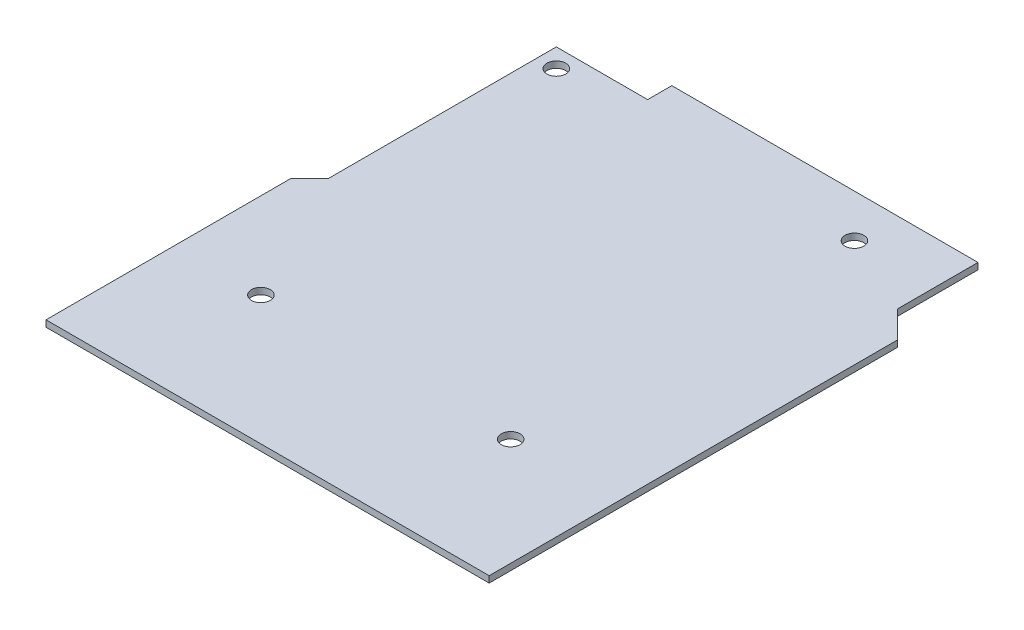
ISO-10303-21;
HEADER;
FILE_DESCRIPTION(('STEP AP214'),'2;1');
FILE_NAME('part.step','',(''),(''),'','','');
FILE_SCHEMA(('AUTOMOTIVE_DESIGN { 1 0 10303 214 1 1 1 1 }'));
ENDSEC;
DATA;
#1=APPLICATION_CONTEXT('core data for automotive mechanical design processes');
#2=APPLICATION_PROTOCOL_DEFINITION('international standard','automotive_design',2000,#1);
#3=PRODUCT_CONTEXT('',#1,'mechanical');
#4=PRODUCT('Part','Part','',(#3));
#5=PRODUCT_RELATED_PRODUCT_CATEGORY('part','',(#4));
#6=PRODUCT_DEFINITION_FORMATION('','',#4);
#7=PRODUCT_DEFINITION_CONTEXT('part definition',#1,'design');
#8=PRODUCT_DEFINITION('design','',#6,#7);
#9=PRODUCT_DEFINITION_SHAPE('','',#8);
#10=(LENGTH_UNIT() NAMED_UNIT(*) SI_UNIT(.MILLI.,.METRE.));
#11=(NAMED_UNIT(*) PLANE_ANGLE_UNIT() SI_UNIT($,.RADIAN.));
#12=(NAMED_UNIT(*) SI_UNIT($,.STERADIAN.) SOLID_ANGLE_UNIT());
#13=UNCERTAINTY_MEASURE_WITH_UNIT(LENGTH_MEASURE(1.E-05),#10,'distance_accuracy_value','');
#14=(GEOMETRIC_REPRESENTATION_CONTEXT(3) GLOBAL_UNCERTAINTY_ASSIGNED_CONTEXT((#13)) GLOBAL_UNIT_ASSIGNED_CONTEXT((#10,
#11,#12)) REPRESENTATION_CONTEXT('',''));
#15=CARTESIAN_POINT('',(0.,0.,0.));
#16=DIRECTION('',(0.,0.,1.));
#17=DIRECTION('',(1.,0.,0.));
#18=AXIS2_PLACEMENT_3D('',#15,#16,#17);
#19=CARTESIAN_POINT('',(0.,1.2,0.));
#20=DIRECTION('',(0.,-1.,0.));
#21=DIRECTION('',(0.,0.,-1.));
#22=AXIS2_PLACEMENT_3D('',#19,#20,#21);
#23=PLANE('',#22);
#24=DIRECTION('',(1.,0.,0.));
#25=VECTOR('',#24,1.);
#26=CARTESIAN_POINT('',(82.5,1.2,0.));
#27=LINE('',#26,#25);
#28=CARTESIAN_POINT('',(0.,1.2,0.));
#29=VERTEX_POINT('',#28);
#30=CARTESIAN_POINT('',(82.5,1.2,0.));
#31=VERTEX_POINT('',#30);
#32=EDGE_CURVE('E182',#29,#31,#27,.T.);
#33=ORIENTED_EDGE('',*,*,#32,.T.);
#34=DIRECTION('',(0.,0.,-1.));
#35=VECTOR('',#34,1.);
#36=CARTESIAN_POINT('',(82.5,1.2,-76.));
#37=LINE('',#36,#35);
#38=CARTESIAN_POINT('',(82.5,1.2,-76.));
#39=VERTEX_POINT('',#38);
#40=EDGE_CURVE('E106',#31,#39,#37,.T.);
#41=ORIENTED_EDGE('',*,*,#40,.T.);
#42=DIRECTION('',(-0.707106781186548,0.,-0.707106781186548));
#43=VECTOR('',#42,1.);
#44=CARTESIAN_POINT('',(77.5,1.2,-81.));
#45=LINE('',#44,#43);
#46=CARTESIAN_POINT('',(77.5,1.2,-81.));
#47=VERTEX_POINT('',#46);
#48=EDGE_CURVE('E211',#39,#47,#45,.T.);
#49=ORIENTED_EDGE('',*,*,#48,.T.);
#50=DIRECTION('',(0.,0.,-1.));
#51=VECTOR('',#50,1.);
#52=CARTESIAN_POINT('',(77.5,1.2,-96.));
#53=LINE('',#52,#51);
#54=CARTESIAN_POINT('',(77.5,1.2,-96.));
#55=VERTEX_POINT('',#54);
#56=EDGE_CURVE('E231',#47,#55,#53,.T.);
#57=ORIENTED_EDGE('',*,*,#56,.T.);
#58=DIRECTION('',(-1.,0.,0.));
#59=VECTOR('',#58,1.);
#60=CARTESIAN_POINT('',(20.5,1.2,-96.));
#61=LINE('',#60,#59);
#62=CARTESIAN_POINT('',(20.5,1.2,-96.));
#63=VERTEX_POINT('',#62);
#64=EDGE_CURVE('E227',#55,#63,#61,.T.);
#65=ORIENTED_EDGE('',*,*,#64,.T.);
#66=DIRECTION('',(0.,0.,1.));
#67=VECTOR('',#66,1.);
#68=CARTESIAN_POINT('',(20.5,1.2,-91.5));
#69=LINE('',#68,#67);
#70=CARTESIAN_POINT('',(20.5,1.2,-91.5));
#71=VERTEX_POINT('',#70);
#72=EDGE_CURVE('E230',#63,#71,#69,.T.);
#73=ORIENTED_EDGE('',*,*,#72,.T.);
#74=DIRECTION('',(-1.,0.,0.));
#75=VECTOR('',#74,1.);
#76=CARTESIAN_POINT('',(3.5,1.2,-91.5));
#77=LINE('',#76,#75);
#78=CARTESIAN_POINT('',(3.5,1.2,-91.5));
#79=VERTEX_POINT('',#78);
#80=EDGE_CURVE('E131',#71,#79,#77,.T.);
#81=ORIENTED_EDGE('',*,*,#80,.T.);
#82=DIRECTION('',(0.,0.,1.));
#83=VECTOR('',#82,1.);
#84=CARTESIAN_POINT('',(3.5,1.2,-49.));
#85=LINE('',#84,#83);
#86=CARTESIAN_POINT('',(3.5,1.2,-49.));
#87=VERTEX_POINT('',#86);
#88=EDGE_CURVE('E125',#79,#87,#85,.T.);
#89=ORIENTED_EDGE('',*,*,#88,.T.);
#90=DIRECTION('',(-0.707106781186547,0.,0.707106781186548));
#91=VECTOR('',#90,1.);
#92=CARTESIAN_POINT('',(0.,1.2,-45.5));
#93=LINE('',#92,#91);
#94=CARTESIAN_POINT('',(0.,1.2,-45.5));
#95=VERTEX_POINT('',#94);
#96=EDGE_CURVE('E129',#87,#95,#93,.T.);
#97=ORIENTED_EDGE('',*,*,#96,.T.);
#98=DIRECTION('',(0.,0.,1.));
#99=VECTOR('',#98,1.);
#100=CARTESIAN_POINT('',(0.,1.2,0.));
#101=LINE('',#100,#99);
#102=EDGE_CURVE('E57',#95,#29,#101,.T.);
#103=ORIENTED_EDGE('',*,*,#102,.T.);
#104=EDGE_LOOP('',(#33,#41,#49,#57,#65,#73,#81,#89,#97,#103));
#105=FACE_BOUND('',#104,.T.);
#106=CARTESIAN_POINT('',(6.99999999999999,1.2,-88.));
#107=DIRECTION('',(0.,1.,0.));
#108=DIRECTION('',(0.,0.,1.));
#109=AXIS2_PLACEMENT_3D('',#106,#107,#108);
#110=CIRCLE('',#109,1.75);
#111=CARTESIAN_POINT('',(6.99999999999999,1.2,-86.25));
#112=VERTEX_POINT('',#111);
#113=EDGE_CURVE('E158',#112,#112,#110,.T.);
#114=ORIENTED_EDGE('',*,*,#113,.F.);
#115=EDGE_LOOP('',(#114));
#116=FACE_BOUND('',#115,.T.);
#117=CARTESIAN_POINT('',(62.5,1.2,-88.));
#118=DIRECTION('',(0.,1.,0.));
#119=DIRECTION('',(0.,0.,1.));
#120=AXIS2_PLACEMENT_3D('',#117,#118,#119);
#121=CIRCLE('',#120,1.75);
#122=CARTESIAN_POINT('',(62.5,1.2,-86.25));
#123=VERTEX_POINT('',#122);
#124=EDGE_CURVE('E249',#123,#123,#121,.T.);
#125=ORIENTED_EDGE('',*,*,#124,.F.);
#126=EDGE_LOOP('',(#125));
#127=FACE_BOUND('',#126,.T.);
#128=CARTESIAN_POINT('',(62.5,1.2,-24.));
#129=DIRECTION('',(0.,1.,0.));
#130=DIRECTION('',(0.,0.,1.));
#131=AXIS2_PLACEMENT_3D('',#128,#129,#130);
#132=CIRCLE('',#131,1.75);
#133=CARTESIAN_POINT('',(62.5,1.2,-22.25));
#134=VERTEX_POINT('',#133);
#135=EDGE_CURVE('E257',#134,#134,#132,.T.);
#136=ORIENTED_EDGE('',*,*,#135,.F.);
#137=EDGE_LOOP('',(#136));
#138=FACE_BOUND('',#137,.T.);
#139=CARTESIAN_POINT('',(16.,1.2,-24.));
#140=DIRECTION('',(0.,1.,0.));
#141=DIRECTION('',(0.,0.,1.));
#142=AXIS2_PLACEMENT_3D('',#139,#140,#141);
#143=CIRCLE('',#142,1.75);
#144=CARTESIAN_POINT('',(16.,1.2,-22.25));
#145=VERTEX_POINT('',#144);
#146=EDGE_CURVE('E265',#145,#145,#143,.T.);
#147=ORIENTED_EDGE('',*,*,#146,.F.);
#148=EDGE_LOOP('',(#147));
#149=FACE_BOUND('',#148,.T.);
#150=ADVANCED_FACE('F39',(#105,#116,#127,#138,#149),#23,.F.);
#151=CARTESIAN_POINT('',(0.,0.,0.));
#152=DIRECTION('',(0.,-1.,0.));
#153=DIRECTION('',(0.,0.,-1.));
#154=AXIS2_PLACEMENT_3D('',#151,#152,#153);
#155=PLANE('',#154);
#156=CARTESIAN_POINT('',(62.5,0.,-24.));
#157=DIRECTION('',(0.,1.,0.));
#158=DIRECTION('',(0.,0.,1.));
#159=AXIS2_PLACEMENT_3D('',#156,#157,#158);
#160=CIRCLE('',#159,1.75);
#161=CARTESIAN_POINT('',(62.5,0.,-22.25));
#162=VERTEX_POINT('',#161);
#163=EDGE_CURVE('E261',#162,#162,#160,.T.);
#164=ORIENTED_EDGE('',*,*,#163,.T.);
#165=EDGE_LOOP('',(#164));
#166=FACE_BOUND('',#165,.T.);
#167=CARTESIAN_POINT('',(6.99999999999999,0.,-88.));
#168=DIRECTION('',(0.,1.,0.));
#169=DIRECTION('',(0.,0.,1.));
#170=AXIS2_PLACEMENT_3D('',#167,#168,#169);
#171=CIRCLE('',#170,1.75);
#172=CARTESIAN_POINT('',(6.99999999999999,0.,-86.25));
#173=VERTEX_POINT('',#172);
#174=EDGE_CURVE('E245',#173,#173,#171,.T.);
#175=ORIENTED_EDGE('',*,*,#174,.T.);
#176=EDGE_LOOP('',(#175));
#177=FACE_BOUND('',#176,.T.);
#178=DIRECTION('',(1.,0.,0.));
#179=VECTOR('',#178,1.);
#180=CARTESIAN_POINT('',(82.5,0.,0.));
#181=LINE('',#180,#179);
#182=CARTESIAN_POINT('',(0.,0.,0.));
#183=VERTEX_POINT('',#182);
#184=CARTESIAN_POINT('',(82.5,0.,0.));
#185=VERTEX_POINT('',#184);
#186=EDGE_CURVE('E153',#183,#185,#181,.T.);
#187=ORIENTED_EDGE('',*,*,#186,.F.);
#188=DIRECTION('',(0.,0.,1.));
#189=VECTOR('',#188,1.);
#190=CARTESIAN_POINT('',(0.,0.,0.));
#191=LINE('',#190,#189);
#192=CARTESIAN_POINT('',(0.,0.,-45.5));
#193=VERTEX_POINT('',#192);
#194=EDGE_CURVE('E98',#193,#183,#191,.T.);
#195=ORIENTED_EDGE('',*,*,#194,.F.);
#196=DIRECTION('',(-0.707106781186547,0.,0.707106781186548));
#197=VECTOR('',#196,1.);
#198=CARTESIAN_POINT('',(0.,0.,-45.5));
#199=LINE('',#198,#197);
#200=CARTESIAN_POINT('',(3.5,0.,-49.));
#201=VERTEX_POINT('',#200);
#202=EDGE_CURVE('E92',#201,#193,#199,.T.);
#203=ORIENTED_EDGE('',*,*,#202,.F.);
#204=DIRECTION('',(0.,0.,1.));
#205=VECTOR('',#204,1.);
#206=CARTESIAN_POINT('',(3.5,0.,-49.));
#207=LINE('',#206,#205);
#208=CARTESIAN_POINT('',(3.5,0.,-91.5));
#209=VERTEX_POINT('',#208);
#210=EDGE_CURVE('E140',#209,#201,#207,.T.);
#211=ORIENTED_EDGE('',*,*,#210,.F.);
#212=DIRECTION('',(-1.,0.,0.));
#213=VECTOR('',#212,1.);
#214=CARTESIAN_POINT('',(3.5,0.,-91.5));
#215=LINE('',#214,#213);
#216=CARTESIAN_POINT('',(20.5,0.,-91.5));
#217=VERTEX_POINT('',#216);
#218=EDGE_CURVE('E173',#217,#209,#215,.T.);
#219=ORIENTED_EDGE('',*,*,#218,.F.);
#220=DIRECTION('',(0.,0.,1.));
#221=VECTOR('',#220,1.);
#222=CARTESIAN_POINT('',(20.5,0.,-91.5));
#223=LINE('',#222,#221);
#224=CARTESIAN_POINT('',(20.5,0.,-96.));
#225=VERTEX_POINT('',#224);
#226=EDGE_CURVE('E170',#225,#217,#223,.T.);
#227=ORIENTED_EDGE('',*,*,#226,.F.);
#228=DIRECTION('',(-1.,0.,0.));
#229=VECTOR('',#228,1.);
#230=CARTESIAN_POINT('',(20.5,0.,-96.));
#231=LINE('',#230,#229);
#232=CARTESIAN_POINT('',(77.5,0.,-96.));
#233=VERTEX_POINT('',#232);
#234=EDGE_CURVE('E167',#233,#225,#231,.T.);
#235=ORIENTED_EDGE('',*,*,#234,.F.);
#236=DIRECTION('',(0.,0.,-1.));
#237=VECTOR('',#236,1.);
#238=CARTESIAN_POINT('',(77.5,0.,-96.));
#239=LINE('',#238,#237);
#240=CARTESIAN_POINT('',(77.5,0.,-81.));
#241=VERTEX_POINT('',#240);
#242=EDGE_CURVE('E164',#241,#233,#239,.T.);
#243=ORIENTED_EDGE('',*,*,#242,.F.);
#244=DIRECTION('',(-0.707106781186548,0.,-0.707106781186548));
#245=VECTOR('',#244,1.);
#246=CARTESIAN_POINT('',(77.5,0.,-81.));
#247=LINE('',#246,#245);
#248=CARTESIAN_POINT('',(82.5,0.,-76.));
#249=VERTEX_POINT('',#248);
#250=EDGE_CURVE('E161',#249,#241,#247,.T.);
#251=ORIENTED_EDGE('',*,*,#250,.F.);
#252=DIRECTION('',(0.,0.,-1.));
#253=VECTOR('',#252,1.);
#254=CARTESIAN_POINT('',(82.5,0.,-76.));
#255=LINE('',#254,#253);
#256=EDGE_CURVE('E157',#185,#249,#255,.T.);
#257=ORIENTED_EDGE('',*,*,#256,.F.);
#258=EDGE_LOOP('',(#187,#195,#203,#211,#219,#227,#235,#243,#251,#257));
#259=FACE_BOUND('',#258,.T.);
#260=CARTESIAN_POINT('',(62.5,0.,-88.));
#261=DIRECTION('',(0.,1.,0.));
#262=DIRECTION('',(0.,0.,1.));
#263=AXIS2_PLACEMENT_3D('',#260,#261,#262);
#264=CIRCLE('',#263,1.75);
#265=CARTESIAN_POINT('',(62.5,0.,-86.25));
#266=VERTEX_POINT('',#265);
#267=EDGE_CURVE('E253',#266,#266,#264,.T.);
#268=ORIENTED_EDGE('',*,*,#267,.T.);
#269=EDGE_LOOP('',(#268));
#270=FACE_BOUND('',#269,.T.);
#271=CARTESIAN_POINT('',(16.,0.,-24.));
#272=DIRECTION('',(0.,1.,0.));
#273=DIRECTION('',(0.,0.,1.));
#274=AXIS2_PLACEMENT_3D('',#271,#272,#273);
#275=CIRCLE('',#274,1.75);
#276=CARTESIAN_POINT('',(16.,0.,-22.25));
#277=VERTEX_POINT('',#276);
#278=EDGE_CURVE('E269',#277,#277,#275,.T.);
#279=ORIENTED_EDGE('',*,*,#278,.T.);
#280=EDGE_LOOP('',(#279));
#281=FACE_BOUND('',#280,.T.);
#282=ADVANCED_FACE('F215',(#166,#177,#259,#270,#281),#155,.T.);
#283=CARTESIAN_POINT('',(82.5,1.2,0.));
#284=DIRECTION('',(0.,0.,-1.));
#285=DIRECTION('',(-1.,0.,0.));
#286=AXIS2_PLACEMENT_3D('',#283,#284,#285);
#287=PLANE('',#286);
#288=ORIENTED_EDGE('',*,*,#186,.T.);
#289=DIRECTION('',(0.,-1.,0.));
#290=VECTOR('',#289,1.);
#291=CARTESIAN_POINT('',(82.5,1.2,0.));
#292=LINE('',#291,#290);
#293=EDGE_CURVE('E11',#31,#185,#292,.T.);
#294=ORIENTED_EDGE('',*,*,#293,.F.);
#295=ORIENTED_EDGE('',*,*,#32,.F.);
#296=DIRECTION('',(0.,-1.,0.));
#297=VECTOR('',#296,1.);
#298=CARTESIAN_POINT('',(0.,1.2,0.));
#299=LINE('',#298,#297);
#300=EDGE_CURVE('E149',#29,#183,#299,.T.);
#301=ORIENTED_EDGE('',*,*,#300,.T.);
#302=EDGE_LOOP('',(#288,#294,#295,#301));
#303=FACE_BOUND('',#302,.T.);
#304=ADVANCED_FACE('F41',(#303),#287,.F.);
#305=CARTESIAN_POINT('',(82.5,1.2,-76.));
#306=DIRECTION('',(-1.,0.,0.));
#307=DIRECTION('',(0.,0.,1.));
#308=AXIS2_PLACEMENT_3D('',#305,#306,#307);
#309=PLANE('',#308);
#310=ORIENTED_EDGE('',*,*,#256,.T.);
#311=DIRECTION('',(0.,-1.,0.));
#312=VECTOR('',#311,1.);
#313=CARTESIAN_POINT('',(82.5,1.2,-76.));
#314=LINE('',#313,#312);
#315=EDGE_CURVE('E49',#39,#249,#314,.T.);
#316=ORIENTED_EDGE('',*,*,#315,.F.);
#317=ORIENTED_EDGE('',*,*,#40,.F.);
#318=ORIENTED_EDGE('',*,*,#293,.T.);
#319=EDGE_LOOP('',(#310,#316,#317,#318));
#320=FACE_BOUND('',#319,.T.);
#321=ADVANCED_FACE('F311',(#320),#309,.F.);
#322=CARTESIAN_POINT('',(77.5,1.2,-81.));
#323=DIRECTION('',(-0.707106781186548,0.,0.707106781186548));
#324=DIRECTION('',(0.707106781186548,0.,0.707106781186548));
#325=AXIS2_PLACEMENT_3D('',#322,#323,#324);
#326=PLANE('',#325);
#327=ORIENTED_EDGE('',*,*,#250,.T.);
#328=DIRECTION('',(0.,-1.,0.));
#329=VECTOR('',#328,1.);
#330=CARTESIAN_POINT('',(77.5,1.2,-81.));
#331=LINE('',#330,#329);
#332=EDGE_CURVE('E201',#47,#241,#331,.T.);
#333=ORIENTED_EDGE('',*,*,#332,.F.);
#334=ORIENTED_EDGE('',*,*,#48,.F.);
#335=ORIENTED_EDGE('',*,*,#315,.T.);
#336=EDGE_LOOP('',(#327,#333,#334,#335));
#337=FACE_BOUND('',#336,.T.);
#338=ADVANCED_FACE('F209',(#337),#326,.F.);
#339=CARTESIAN_POINT('',(77.5,1.2,-96.));
#340=DIRECTION('',(-1.,0.,0.));
#341=DIRECTION('',(0.,0.,1.));
#342=AXIS2_PLACEMENT_3D('',#339,#340,#341);
#343=PLANE('',#342);
#344=ORIENTED_EDGE('',*,*,#242,.T.);
#345=DIRECTION('',(0.,-1.,0.));
#346=VECTOR('',#345,1.);
#347=CARTESIAN_POINT('',(77.5,1.2,-96.));
#348=LINE('',#347,#346);
#349=EDGE_CURVE('E197',#55,#233,#348,.T.);
#350=ORIENTED_EDGE('',*,*,#349,.F.);
#351=ORIENTED_EDGE('',*,*,#56,.F.);
#352=ORIENTED_EDGE('',*,*,#332,.T.);
#353=EDGE_LOOP('',(#344,#350,#351,#352));
#354=FACE_BOUND('',#353,.T.);
#355=ADVANCED_FACE('F221',(#354),#343,.F.);
#356=CARTESIAN_POINT('',(20.5,1.2,-96.));
#357=DIRECTION('',(0.,0.,1.));
#358=DIRECTION('',(1.,0.,0.));
#359=AXIS2_PLACEMENT_3D('',#356,#357,#358);
#360=PLANE('',#359);
#361=ORIENTED_EDGE('',*,*,#234,.T.);
#362=DIRECTION('',(0.,-1.,0.));
#363=VECTOR('',#362,1.);
#364=CARTESIAN_POINT('',(20.5,1.2,-96.));
#365=LINE('',#364,#363);
#366=EDGE_CURVE('E193',#63,#225,#365,.T.);
#367=ORIENTED_EDGE('',*,*,#366,.F.);
#368=ORIENTED_EDGE('',*,*,#64,.F.);
#369=ORIENTED_EDGE('',*,*,#349,.T.);
#370=EDGE_LOOP('',(#361,#367,#368,#369));
#371=FACE_BOUND('',#370,.T.);
#372=ADVANCED_FACE('F225',(#371),#360,.F.);
#373=CARTESIAN_POINT('',(20.5,1.2,-91.5));
#374=DIRECTION('',(1.,0.,0.));
#375=DIRECTION('',(0.,0.,-1.));
#376=AXIS2_PLACEMENT_3D('',#373,#374,#375);
#377=PLANE('',#376);
#378=ORIENTED_EDGE('',*,*,#226,.T.);
#379=DIRECTION('',(0.,-1.,0.));
#380=VECTOR('',#379,1.);
#381=CARTESIAN_POINT('',(20.5,1.2,-91.5));
#382=LINE('',#381,#380);
#383=EDGE_CURVE('E189',#71,#217,#382,.T.);
#384=ORIENTED_EDGE('',*,*,#383,.F.);
#385=ORIENTED_EDGE('',*,*,#72,.F.);
#386=ORIENTED_EDGE('',*,*,#366,.T.);
#387=EDGE_LOOP('',(#378,#384,#385,#386));
#388=FACE_BOUND('',#387,.T.);
#389=ADVANCED_FACE('F301',(#388),#377,.F.);
#390=CARTESIAN_POINT('',(3.5,1.2,-91.5));
#391=DIRECTION('',(0.,0.,1.));
#392=DIRECTION('',(1.,0.,0.));
#393=AXIS2_PLACEMENT_3D('',#390,#391,#392);
#394=PLANE('',#393);
#395=ORIENTED_EDGE('',*,*,#218,.T.);
#396=DIRECTION('',(0.,-1.,0.));
#397=VECTOR('',#396,1.);
#398=CARTESIAN_POINT('',(3.5,1.2,-91.5));
#399=LINE('',#398,#397);
#400=EDGE_CURVE('E142',#79,#209,#399,.T.);
#401=ORIENTED_EDGE('',*,*,#400,.F.);
#402=ORIENTED_EDGE('',*,*,#80,.F.);
#403=ORIENTED_EDGE('',*,*,#383,.T.);
#404=EDGE_LOOP('',(#395,#401,#402,#403));
#405=FACE_BOUND('',#404,.T.);
#406=ADVANCED_FACE('F298',(#405),#394,.F.);
#407=CARTESIAN_POINT('',(3.5,1.2,-49.));
#408=DIRECTION('',(1.,0.,0.));
#409=DIRECTION('',(0.,0.,-1.));
#410=AXIS2_PLACEMENT_3D('',#407,#408,#409);
#411=PLANE('',#410);
#412=ORIENTED_EDGE('',*,*,#210,.T.);
#413=DIRECTION('',(0.,-1.,0.));
#414=VECTOR('',#413,1.);
#415=CARTESIAN_POINT('',(3.5,1.2,-49.));
#416=LINE('',#415,#414);
#417=EDGE_CURVE('E137',#87,#201,#416,.T.);
#418=ORIENTED_EDGE('',*,*,#417,.F.);
#419=ORIENTED_EDGE('',*,*,#88,.F.);
#420=ORIENTED_EDGE('',*,*,#400,.T.);
#421=EDGE_LOOP('',(#412,#418,#419,#420));
#422=FACE_BOUND('',#421,.T.);
#423=ADVANCED_FACE('F138',(#422),#411,.F.);
#424=CARTESIAN_POINT('',(0.,1.2,-45.5));
#425=DIRECTION('',(0.707106781186548,0.,0.707106781186547));
#426=DIRECTION('',(0.707106781186547,0.,-0.707106781186548));
#427=AXIS2_PLACEMENT_3D('',#424,#425,#426);
#428=PLANE('',#427);
#429=ORIENTED_EDGE('',*,*,#202,.T.);
#430=DIRECTION('',(0.,-1.,0.));
#431=VECTOR('',#430,1.);
#432=CARTESIAN_POINT('',(0.,1.2,-45.5));
#433=LINE('',#432,#431);
#434=EDGE_CURVE('E143',#95,#193,#433,.T.);
#435=ORIENTED_EDGE('',*,*,#434,.F.);
#436=ORIENTED_EDGE('',*,*,#96,.F.);
#437=ORIENTED_EDGE('',*,*,#417,.T.);
#438=EDGE_LOOP('',(#429,#435,#436,#437));
#439=FACE_BOUND('',#438,.T.);
#440=ADVANCED_FACE('F145',(#439),#428,.F.);
#441=CARTESIAN_POINT('',(0.,1.2,0.));
#442=DIRECTION('',(1.,0.,0.));
#443=DIRECTION('',(0.,0.,-1.));
#444=AXIS2_PLACEMENT_3D('',#441,#442,#443);
#445=PLANE('',#444);
#446=ORIENTED_EDGE('',*,*,#194,.T.);
#447=ORIENTED_EDGE('',*,*,#300,.F.);
#448=ORIENTED_EDGE('',*,*,#102,.F.);
#449=ORIENTED_EDGE('',*,*,#434,.T.);
#450=EDGE_LOOP('',(#446,#447,#448,#449));
#451=FACE_BOUND('',#450,.T.);
#452=ADVANCED_FACE('F291',(#451),#445,.F.);
#453=CARTESIAN_POINT('',(6.99999999999999,1.2,-88.));
#454=DIRECTION('',(0.,-1.,0.));
#455=DIRECTION('',(0.,0.,-1.));
#456=AXIS2_PLACEMENT_3D('',#453,#454,#455);
#457=CYLINDRICAL_SURFACE('',#456,1.75);
#458=ORIENTED_EDGE('',*,*,#113,.T.);
#459=EDGE_LOOP('',(#458));
#460=FACE_BOUND('',#459,.T.);
#461=ORIENTED_EDGE('',*,*,#174,.F.);
#462=EDGE_LOOP('',(#461));
#463=FACE_BOUND('',#462,.T.);
#464=ADVANCED_FACE('F288',(#460,#463),#457,.F.);
#465=CARTESIAN_POINT('',(62.5,1.2,-88.));
#466=DIRECTION('',(0.,-1.,0.));
#467=DIRECTION('',(0.,0.,-1.));
#468=AXIS2_PLACEMENT_3D('',#465,#466,#467);
#469=CYLINDRICAL_SURFACE('',#468,1.75);
#470=ORIENTED_EDGE('',*,*,#124,.T.);
#471=EDGE_LOOP('',(#470));
#472=FACE_BOUND('',#471,.T.);
#473=ORIENTED_EDGE('',*,*,#267,.F.);
#474=EDGE_LOOP('',(#473));
#475=FACE_BOUND('',#474,.T.);
#476=ADVANCED_FACE('F387',(#472,#475),#469,.F.);
#477=CARTESIAN_POINT('',(62.5,1.2,-24.));
#478=DIRECTION('',(0.,-1.,0.));
#479=DIRECTION('',(0.,0.,-1.));
#480=AXIS2_PLACEMENT_3D('',#477,#478,#479);
#481=CYLINDRICAL_SURFACE('',#480,1.75);
#482=ORIENTED_EDGE('',*,*,#135,.T.);
#483=EDGE_LOOP('',(#482));
#484=FACE_BOUND('',#483,.T.);
#485=ORIENTED_EDGE('',*,*,#163,.F.);
#486=EDGE_LOOP('',(#485));
#487=FACE_BOUND('',#486,.T.);
#488=ADVANCED_FACE('F395',(#484,#487),#481,.F.);
#489=CARTESIAN_POINT('',(16.,1.2,-24.));
#490=DIRECTION('',(0.,-1.,0.));
#491=DIRECTION('',(0.,0.,-1.));
#492=AXIS2_PLACEMENT_3D('',#489,#490,#491);
#493=CYLINDRICAL_SURFACE('',#492,1.75);
#494=ORIENTED_EDGE('',*,*,#146,.T.);
#495=EDGE_LOOP('',(#494));
#496=FACE_BOUND('',#495,.T.);
#497=ORIENTED_EDGE('',*,*,#278,.F.);
#498=EDGE_LOOP('',(#497));
#499=FACE_BOUND('',#498,.T.);
#500=ADVANCED_FACE('F277',(#496,#499),#493,.F.);
#501=CLOSED_SHELL('',(#150,#282,#304,#321,#338,#355,#372,#389,#406,#423,#440,#452,#464,#476,
#488,#500));
#502=MANIFOLD_SOLID_BREP('B2',#501);
#503=ADVANCED_BREP_SHAPE_REPRESENTATION('',(#18,#502),#14);
#504=SHAPE_DEFINITION_REPRESENTATION(#9,#503);
ENDSEC;
END-ISO-10303-21;
